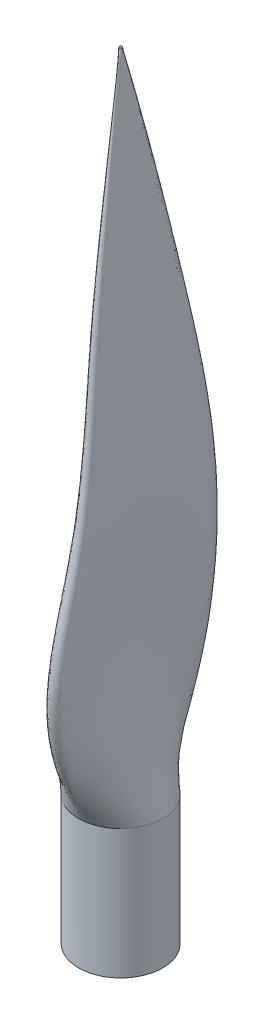
ISO-10303-21;
HEADER;
FILE_DESCRIPTION(('STEP AP214'),'2;1');
FILE_NAME('part.step','',(''),(''),'','','');
FILE_SCHEMA(('AUTOMOTIVE_DESIGN { 1 0 10303 214 1 1 1 1 }'));
ENDSEC;
DATA;
#1=APPLICATION_CONTEXT('core data for automotive mechanical design processes');
#2=APPLICATION_PROTOCOL_DEFINITION('international standard','automotive_design',2000,#1);
#3=PRODUCT_CONTEXT('',#1,'mechanical');
#4=PRODUCT('Part','Part','',(#3));
#5=PRODUCT_RELATED_PRODUCT_CATEGORY('part','',(#4));
#6=PRODUCT_DEFINITION_FORMATION('','',#4);
#7=PRODUCT_DEFINITION_CONTEXT('part definition',#1,'design');
#8=PRODUCT_DEFINITION('design','',#6,#7);
#9=PRODUCT_DEFINITION_SHAPE('','',#8);
#10=(LENGTH_UNIT() NAMED_UNIT(*) SI_UNIT(.MILLI.,.METRE.));
#11=(NAMED_UNIT(*) PLANE_ANGLE_UNIT() SI_UNIT($,.RADIAN.));
#12=(NAMED_UNIT(*) SI_UNIT($,.STERADIAN.) SOLID_ANGLE_UNIT());
#13=UNCERTAINTY_MEASURE_WITH_UNIT(LENGTH_MEASURE(1.E-05),#10,'distance_accuracy_value','');
#14=(GEOMETRIC_REPRESENTATION_CONTEXT(3) GLOBAL_UNCERTAINTY_ASSIGNED_CONTEXT((#13)) GLOBAL_UNIT_ASSIGNED_CONTEXT((#10,
#11,#12)) REPRESENTATION_CONTEXT('',''));
#15=CARTESIAN_POINT('',(0.,0.,0.));
#16=DIRECTION('',(0.,0.,1.));
#17=DIRECTION('',(1.,0.,0.));
#18=AXIS2_PLACEMENT_3D('',#15,#16,#17);
#19=CARTESIAN_POINT('',(0.,25.4,0.));
#20=DIRECTION('',(0.,-1.,0.));
#21=DIRECTION('',(0.,0.,-1.));
#22=AXIS2_PLACEMENT_3D('',#19,#20,#21);
#23=CYLINDRICAL_SURFACE('',#22,8.255);
#24=CARTESIAN_POINT('',(-4.27335253741302,25.4,-7.06282401670788));
#25=CARTESIAN_POINT('',(-4.96751837407308,25.4,-6.6428198749268));
#26=CARTESIAN_POINT('',(-6.27390073355286,25.4,-5.57087664302351));
#27=CARTESIAN_POINT('',(-7.7233117066584,25.4,-3.31584363807376));
#28=CARTESIAN_POINT('',(-8.39728544612705,25.4,-0.587640107449926));
#29=CARTESIAN_POINT('',(-8.10485596471392,25.4,2.30730782451024));
#30=CARTESIAN_POINT('',(-6.80747499668056,25.4,4.97227540233478));
#31=CARTESIAN_POINT('',(-4.66381845467683,25.4000000000001,7.01855296357349));
#32=CARTESIAN_POINT('',(-1.99557720816509,25.4,8.17777841993293));
#33=CARTESIAN_POINT('',(-0.127449606695181,25.4,8.303204000817));
#34=CARTESIAN_POINT('',(0.851143469705664,25.4,8.21139759576036));
#35=CARTESIAN_POINT('',(0.986253238460855,25.4,8.19681343529115));
#36=CARTESIAN_POINT('',(1.14731807820375,25.4,8.17509893668734));
#37=CARTESIAN_POINT('',(1.30038726857369,25.4,8.1523793231605));
#38=CARTESIAN_POINT('',(1.44941504194977,25.4,8.12747458918216));
#39=CARTESIAN_POINT('',(1.5983556307111,25.4,8.09920472922387));
#40=CARTESIAN_POINT('',(1.75059195620452,25.4,8.06746100787425));
#41=CARTESIAN_POINT('',(1.90950693977689,25.4,8.03213468972193));
#42=CARTESIAN_POINT('',(2.04335648774073,25.4,7.99853313768677));
#43=CARTESIAN_POINT('',(2.96636723888064,25.4,7.75287824941489));
#44=CARTESIAN_POINT('',(4.62553703261927,25.3999999999999,7.02181328117393));
#45=CARTESIAN_POINT('',(6.6987811872302,25.4000000000001,5.0980405105209));
#46=CARTESIAN_POINT('',(8.03066772653249,25.4,2.53574065961163));
#47=CARTESIAN_POINT('',(8.4117619604781,25.4,-0.32729039302094));
#48=CARTESIAN_POINT('',(7.81882431463251,25.4000000000001,-3.09344168533715));
#49=CARTESIAN_POINT('',(6.4096553740129,25.3999999999999,-5.42175842642299));
#50=CARTESIAN_POINT('',(4.44751141004057,25.4,-7.10255930683849));
#51=CARTESIAN_POINT('',(2.95965885796555,25.4,-7.74527804177849));
#52=CARTESIAN_POINT('',(1.82444187679371,25.4,-8.06085403114165));
#53=CARTESIAN_POINT('',(1.1897000552001,25.4,-8.1833639678869));
#54=CARTESIAN_POINT('',(0.358492645730804,25.4,-8.26054057622775));
#55=CARTESIAN_POINT('',(-0.401817806740622,25.4,-8.2557434362236));
#56=CARTESIAN_POINT('',(-1.13321159390835,25.4,-8.18813039559228));
#57=CARTESIAN_POINT('',(-1.85480147661309,25.4,-8.05480391894988));
#58=CARTESIAN_POINT('',(-2.58664795014502,25.4,-7.85312246201889));
#59=CARTESIAN_POINT('',(-3.36202806684108,25.4,-7.55504724421398));
#60=CARTESIAN_POINT('',(-3.93567658451538,25.4,-7.26713441532858));
#61=CARTESIAN_POINT('',(-4.27335253741302,25.4,-7.06282401670788));
#62=B_SPLINE_CURVE_WITH_KNOTS('',3,(#24,#25,#26,#27,#28,#29,#30,#31,#32,#33,#34,#35,#36,#37,#38,
#39,#40,#41,#42,#43,#44,#45,#46,#47,#48,#49,#50,#51,#52,#53,#54,#55,#56,#57,#58,#59,#60,#61),
.UNSPECIFIED.,.T.,.F.,(4,1,1,1,1,1,1,1,2,1,1,1,1,1,1,1,2,1,1,1,1,1,1,1,2,1,1,1,1,1,1,1,4),(0.,
0.0496445956659812,0.0992891913319621,0.148933786997943,0.198578382663925,0.248222978329906,
0.297867573995887,0.347512169661868,0.397156765327849,0.401581875505884,0.406006985683918,
0.410432095861953,0.414857206039987,0.419282316218022,0.423707426396056,0.42813253657409,
0.432557646752125,0.479338400175326,0.526119153598528,0.572899907021729,0.619680660444931,
0.666461413868133,0.713242167291334,0.760022920714536,0.806803674137737,0.83095321487052,
0.855102755603303,0.879252296336086,0.903401837068869,0.927551377801651,0.951700918534434,
0.975850459267217,1.),.UNSPECIFIED.);
#63=CARTESIAN_POINT('',(-4.27335253741302,25.4,-7.06282401670788));
#64=VERTEX_POINT('',#63);
#65=EDGE_CURVE('E11',#64,#64,#62,.T.);
#66=ORIENTED_EDGE('',*,*,#65,.F.);
#67=EDGE_LOOP('',(#66));
#68=FACE_BOUND('',#67,.T.);
#69=CARTESIAN_POINT('',(0.,0.,0.));
#70=DIRECTION('',(0.,1.,0.));
#71=DIRECTION('',(0.,0.,1.));
#72=AXIS2_PLACEMENT_3D('',#69,#70,#71);
#73=CIRCLE('',#72,8.255);
#74=CARTESIAN_POINT('',(0.,0.,8.255));
#75=VERTEX_POINT('',#74);
#76=EDGE_CURVE('E240',#75,#75,#73,.T.);
#77=ORIENTED_EDGE('',*,*,#76,.T.);
#78=EDGE_LOOP('',(#77));
#79=FACE_BOUND('',#78,.T.);
#80=ADVANCED_FACE('F231',(#68,#79),#23,.T.);
#81=CARTESIAN_POINT('',(0.,0.,0.));
#82=DIRECTION('',(0.,1.,0.));
#83=DIRECTION('',(0.,0.,1.));
#84=AXIS2_PLACEMENT_3D('',#81,#82,#83);
#85=PLANE('',#84);
#86=ORIENTED_EDGE('',*,*,#76,.F.);
#87=EDGE_LOOP('',(#86));
#88=FACE_BOUND('',#87,.T.);
#89=ADVANCED_FACE('F255',(#88),#85,.F.);
#90=CARTESIAN_POINT('',(0.,152.4,0.));
#91=DIRECTION('',(0.,1.,0.));
#92=DIRECTION('',(0.,0.,1.));
#93=AXIS2_PLACEMENT_3D('',#90,#91,#92);
#94=PLANE('',#93);
#95=CARTESIAN_POINT('',(0.,152.4,0.));
#96=DIRECTION('',(0.,1.,0.));
#97=DIRECTION('',(0.,0.,1.));
#98=AXIS2_PLACEMENT_3D('',#95,#96,#97);
#99=CIRCLE('',#98,0.254);
#100=CARTESIAN_POINT('',(0.,152.4,0.254));
#101=VERTEX_POINT('',#100);
#102=EDGE_CURVE('E245',#101,#101,#99,.T.);
#103=ORIENTED_EDGE('',*,*,#102,.T.);
#104=EDGE_LOOP('',(#103));
#105=FACE_BOUND('',#104,.T.);
#106=ADVANCED_FACE('F259',(#105),#94,.T.);
#107=CARTESIAN_POINT('',(-0.131487770381939,152.4,-0.21731766205255));
#108=CARTESIAN_POINT('',(-1.41960146994936,137.61434203223,-2.63286612465176));
#109=CARTESIAN_POINT('',(-3.31753423516274,112.279547515883,-6.11377743031786));
#110=CARTESIAN_POINT('',(-5.33355541743683,78.3936427241334,-12.045509500581));
#111=CARTESIAN_POINT('',(-5.15383717455402,50.3634576518224,-10.9212686125526));
#112=CARTESIAN_POINT('',(-4.66664537165213,33.8258304303574,-8.71165835578352));
#113=CARTESIAN_POINT('',(-4.27335253741302,25.4,-7.06282401670788));
#114=CARTESIAN_POINT('',(-0.121097741062012,152.4,-0.223604135856264));
#115=CARTESIAN_POINT('',(-1.44196891087864,137.618442171609,-2.7797593414417));
#116=CARTESIAN_POINT('',(-3.40719570255414,112.278937053666,-6.47474861606908));
#117=CARTESIAN_POINT('',(-5.36283158478709,78.3922457136525,-12.6082475267014));
#118=CARTESIAN_POINT('',(-5.1617313227206,50.3682378420951,-11.6256595710436));
#119=CARTESIAN_POINT('',(-4.42749133224989,33.8149836499334,-9.13145181777863));
#120=CARTESIAN_POINT('',(-3.93567658451538,25.4,-7.26713441532858));
#121=CARTESIAN_POINT('',(-0.102885288226488,152.4,-0.232989880535877));
#122=CARTESIAN_POINT('',(-1.47616371844216,137.627958870959,-3.08846906928819));
#123=CARTESIAN_POINT('',(-3.46004956243505,112.277676756959,-7.27932823339389));
#124=CARTESIAN_POINT('',(-5.2733510664478,78.3886548650568,-13.8168027935753));
#125=CARTESIAN_POINT('',(-4.81962583170467,50.3803635677706,-13.0637975268316));
#126=CARTESIAN_POINT('',(-3.99096471260721,33.7874998476137,-9.88547158293519));
#127=CARTESIAN_POINT('',(-3.36202806684108,25.4,-7.55504724421398));
#128=CARTESIAN_POINT('',(-0.079743437479994,152.4,-0.241339506004));
#129=CARTESIAN_POINT('',(-1.31688828158323,137.647761895818,-3.62985011046791));
#130=CARTESIAN_POINT('',(-3.06274522674674,112.273980611666,-8.60932124769152));
#131=CARTESIAN_POINT('',(-4.37956600425205,78.3835702134387,-15.6853612176166));
#132=CARTESIAN_POINT('',(-3.50694840004733,50.3985313197405,-14.8705993061026));
#133=CARTESIAN_POINT('',(-2.95135827729325,33.7461281260261,-10.7962637319965));
#134=CARTESIAN_POINT('',(-2.58664795014502,25.4,-7.85312246201889));
#135=CARTESIAN_POINT('',(-0.0572524262929098,152.4,-0.247792757177888));
#136=CARTESIAN_POINT('',(-0.89169597044188,137.669330802889,-4.13235318274576));
#137=CARTESIAN_POINT('',(-2.00854342437333,112.268968560854,-9.82287311808933));
#138=CARTESIAN_POINT('',(-2.6510937338539,78.380225421625,-17.1816422644796));
#139=CARTESIAN_POINT('',(-1.55768257057412,50.4118293558784,-16.0084214315663));
#140=CARTESIAN_POINT('',(-1.71523650314419,33.7155991937338,-11.3604326300026));
#141=CARTESIAN_POINT('',(-1.85480147661309,25.4,-8.05480391894988));
#142=CARTESIAN_POINT('',(-0.0349001132110384,152.4,-0.252101520870352));
#143=CARTESIAN_POINT('',(-0.207386431788035,137.683223368341,-4.40649678551348));
#144=CARTESIAN_POINT('',(-0.346019445719911,112.265219780614,-10.4622549723593));
#145=CARTESIAN_POINT('',(-0.327069867347946,78.3792285008187,-17.8229059803825));
#146=CARTESIAN_POINT('',(0.682524011298757,50.4169697608263,-16.2757408183637));
#147=CARTESIAN_POINT('',(-0.373854123789239,33.7036045039023,-11.5327899606597));
#148=CARTESIAN_POINT('',(-1.13321159390835,25.4,-8.18813039559228));
#149=CARTESIAN_POINT('',(-0.0121743567801832,152.4,-0.254017683894204));
#150=CARTESIAN_POINT('',(0.525228199100735,137.681215479665,-4.30859362963104));
#151=CARTESIAN_POINT('',(1.42337697232045,112.265264456903,-10.1901122626682));
#152=CARTESIAN_POINT('',(2.02852366862526,78.3804780667242,-17.3851101149937));
#153=CARTESIAN_POINT('',(2.84314068272501,50.412955755725,-15.635116027051));
#154=CARTESIAN_POINT('',(0.936773415858377,33.7126627067098,-11.3085757288925));
#155=CARTESIAN_POINT('',(-0.401817806740622,25.4,-8.2557434362236));
#156=CARTESIAN_POINT('',(0.0112923892198038,152.4,-0.253919085689212));
#157=CARTESIAN_POINT('',(1.06476140406407,137.667325875494,-3.924846486257));
#158=CARTESIAN_POINT('',(2.72522662983599,112.267866935258,-9.20987897261255));
#159=CARTESIAN_POINT('',(3.856952225808,78.3840220401997,-16.0752904423558));
#160=CARTESIAN_POINT('',(4.57737765474335,50.4002792158789,-14.1997420705297));
#161=CARTESIAN_POINT('',(2.09107928737297,33.741532316145,-10.7318366636549));
#162=CARTESIAN_POINT('',(0.358492645730804,25.4,-8.26054057622775));
#163=CARTESIAN_POINT('',(0.0358676710090707,152.4,-0.252183565695141));
#164=CARTESIAN_POINT('',(1.35623311877245,137.65054250427,-3.43728033014406));
#165=CARTESIAN_POINT('',(3.39393734245482,112.270554980812,-7.96423317114829));
#166=CARTESIAN_POINT('',(4.91324029801107,78.3893197890789,-14.3436235556946));
#167=CARTESIAN_POINT('',(5.59771102517029,50.3819570557434,-12.2182164490496));
#168=CARTESIAN_POINT('',(3.0336291528522,33.7831445418049,-9.875275487661));
#169=CARTESIAN_POINT('',(1.1897000552001,25.4,-8.1833639678869));
#170=CARTESIAN_POINT('',(0.056136673132114,152.4,-0.248026277881282));
#171=CARTESIAN_POINT('',(1.39981062210582,137.640448056181,-3.12759865395654));
#172=CARTESIAN_POINT('',(3.49932842348216,112.271640913826,-7.14860104910119));
#173=CARTESIAN_POINT('',(5.13056349159249,78.3936865072772,-13.1782562474669));
#174=CARTESIAN_POINT('',(5.7435084781135,50.3674444717551,-10.7477713136362));
#175=CARTESIAN_POINT('',(3.41452284267443,33.81599316918,-9.20436562239756));
#176=CARTESIAN_POINT('',(1.82444187679371,25.4,-8.06085403114165));
#177=CARTESIAN_POINT('',(0.0910664263989401,152.4,-0.238316247439338));
#178=CARTESIAN_POINT('',(1.44539795791019,137.627267217758,-2.69094829257171));
#179=CARTESIAN_POINT('',(3.43873713120617,112.273322905696,-6.03826054084985));
#180=CARTESIAN_POINT('',(5.23467503113059,78.398801221484,-11.5585479939895));
#181=CARTESIAN_POINT('',(5.44263579067546,50.3502319459009,-8.6681137941544));
#182=CARTESIAN_POINT('',(4.08665240805011,33.8549951206491,-8.14145920164235));
#183=CARTESIAN_POINT('',(2.95965885796555,25.4,-7.74527804177849));
#184=CARTESIAN_POINT('',(0.137012571484775,152.4,-0.2183519446296));
#185=CARTESIAN_POINT('',(1.44516996831701,137.614080338431,-2.16337741659134));
#186=CARTESIAN_POINT('',(3.39494724871068,112.275764447216,-4.65950077494338));
#187=CARTESIAN_POINT('',(5.33220416154755,78.4022309764491,-9.48957486093227));
#188=CARTESIAN_POINT('',(5.15401600830971,50.3380041778911,-5.99424829905389));
#189=CARTESIAN_POINT('',(4.73294196687297,33.8828353404432,-6.66124258456624));
#190=CARTESIAN_POINT('',(4.44751141004057,25.4,-7.10255930683849));
#191=CARTESIAN_POINT('',(0.197219749229953,152.4,-0.167124975221819));
#192=CARTESIAN_POINT('',(1.48791096062014,137.602545995586,-1.41648484045108));
#193=CARTESIAN_POINT('',(3.31168276468358,112.280942651446,-2.79179982392891));
#194=CARTESIAN_POINT('',(5.48864647917196,78.3984650042984,-6.50049077231564));
#195=CARTESIAN_POINT('',(4.69785034958292,50.3473287778912,-2.22141909469306));
#196=CARTESIAN_POINT('',(5.75290501932014,33.8623575859221,-4.0817748405647));
#197=CARTESIAN_POINT('',(6.4096553740129,25.3999999999999,-5.42175842642299));
#198=CARTESIAN_POINT('',(0.240388018180992,152.4,-0.0948054663111906));
#199=CARTESIAN_POINT('',(1.50835921184476,137.595780431015,-0.696120856795932));
#200=CARTESIAN_POINT('',(3.2577309967711,112.285432332048,-1.02777160530211));
#201=CARTESIAN_POINT('',(5.59488225160752,78.3930264114805,-3.57015099302696));
#202=CARTESIAN_POINT('',(4.38672825690872,50.3623545152811,1.36677184110298));
#203=CARTESIAN_POINT('',(6.44886141560138,33.8289475476373,-1.20219167130447));
#204=CARTESIAN_POINT('',(7.81882431463251,25.4000000000001,-3.09344168533715));
#205=CARTESIAN_POINT('',(0.259266811036513,152.4,-0.0102103720846814));
#206=CARTESIAN_POINT('',(1.51941884055665,137.592613659649,0.010203131452331));
#207=CARTESIAN_POINT('',(3.23360387632776,112.287708960313,0.670176061916787));
#208=CARTESIAN_POINT('',(5.64110401958661,78.3900913103097,-0.677793853983863));
#209=CARTESIAN_POINT('',(4.25170422183868,50.3705399998929,4.83342608786942));
#210=CARTESIAN_POINT('',(6.75082371840853,33.8107288681738,1.88962594304002));
#211=CARTESIAN_POINT('',(8.4117619604781,25.4,-0.32729039302094));
#212=CARTESIAN_POINT('',(0.246605560495143,152.4,0.07784335327074));
#213=CARTESIAN_POINT('',(1.51194545349658,137.592482001608,0.71012747198777));
#214=CARTESIAN_POINT('',(3.24931355665514,112.287328140207,2.34630077305369));
#215=CARTESIAN_POINT('',(5.61119092978413,78.3910265922393,2.18577745677862));
#216=CARTESIAN_POINT('',(4.33903716652844,50.3677517875952,8.27510059344589));
#217=CARTESIAN_POINT('',(6.55552700130805,33.8169768625763,5.0310522592273));
#218=CARTESIAN_POINT('',(8.03066772653249,25.4,2.53574065961163));
#219=CARTESIAN_POINT('',(0.206352965034295,152.4,0.157184064132563));
#220=CARTESIAN_POINT('',(1.49281175182311,137.595363432386,1.4061392342996));
#221=CARTESIAN_POINT('',(3.3001054371459,112.28559183743,4.04600782217775));
#222=CARTESIAN_POINT('',(5.51109870500205,78.3929518603474,5.01842821713763));
#223=CARTESIAN_POINT('',(4.63218808494539,50.3625093564344,11.8043741076301));
#224=CARTESIAN_POINT('',(5.89976610152049,33.8286153594125,8.02426620566437));
#225=CARTESIAN_POINT('',(6.6987811872302,25.4000000000001,5.0980405105209));
#226=CARTESIAN_POINT('',(0.142457723131385,152.4,0.215640114878277));
#227=CARTESIAN_POINT('',(1.45022287846193,137.602473596739,2.11420181714295));
#228=CARTESIAN_POINT('',(3.38745405333366,112.285001716904,5.80612116045961));
#229=CARTESIAN_POINT('',(5.34547227051406,78.3894874610378,7.8280526285485));
#230=CARTESIAN_POINT('',(5.11555307343034,50.3738814649166,15.5062752297756));
#231=CARTESIAN_POINT('',(4.81889261243251,33.8029029465749,10.7326676955433));
#232=CARTESIAN_POINT('',(4.62553703261927,25.3999999999999,7.02181328117393));
#233=CARTESIAN_POINT('',(0.0912728381194043,152.4,0.238550099981997));
#234=CARTESIAN_POINT('',(1.44355521252743,137.610106514005,2.57677279060208));
#235=CARTESIAN_POINT('',(3.43897641686983,112.287850530958,7.06617860150279));
#236=CARTESIAN_POINT('',(5.23538089801472,78.3780246823033,9.68728279387444));
#237=CARTESIAN_POINT('',(5.44025660349457,50.4090028064064,18.1651616051497));
#238=CARTESIAN_POINT('',(4.09204414679592,33.7239926855814,12.2237494408077));
#239=CARTESIAN_POINT('',(2.96636723888064,25.4,7.75287824941489));
#240=CARTESIAN_POINT('',(0.0628725073150994,152.4,0.246108711928824));
#241=CARTESIAN_POINT('',(1.41253686851821,137.616553175384,2.85806740119846));
#242=CARTESIAN_POINT('',(3.48648638903908,112.290310208957,7.77408802895483));
#243=CARTESIAN_POINT('',(5.1505708649026,78.368224163605,10.7178822994041));
#244=CARTESIAN_POINT('',(5.6863143202077,50.439018555688,19.6503571853208));
#245=CARTESIAN_POINT('',(3.54214926376805,33.6565562874003,13.0147246446215));
#246=CARTESIAN_POINT('',(2.04335648774073,25.4,7.99853313768677));
#247=CARTESIAN_POINT('',(0.0587540596854428,152.4,0.247142605837598));
#248=CARTESIAN_POINT('',(1.40752480299773,137.617704490081,2.90695408480176));
#249=CARTESIAN_POINT('',(3.47805118322475,112.290750052854,7.91046339762288));
#250=CARTESIAN_POINT('',(5.11445136463947,78.3664726177953,10.8991839445718));
#251=CARTESIAN_POINT('',(5.67940551232675,50.444382830555,19.9292509543388));
#252=CARTESIAN_POINT('',(3.47054549292518,33.6445043964803,13.1446922228532));
#253=CARTESIAN_POINT('',(1.90950693977689,25.4,8.03213468972193));
#254=CARTESIAN_POINT('',(0.053864367883216,152.4,0.248229569473054));
#255=CARTESIAN_POINT('',(1.37020164984145,137.620230457598,2.9956814447923));
#256=CARTESIAN_POINT('',(3.3932712148976,112.291042715882,8.15095579565818));
#257=CARTESIAN_POINT('',(4.98104430164541,78.3641248585196,11.1452125377497));
#258=CARTESIAN_POINT('',(5.53031098572933,50.4517280252338,20.3708563512662));
#259=CARTESIAN_POINT('',(3.30776073787769,33.6279688880941,13.348559179525));
#260=CARTESIAN_POINT('',(1.75059195620452,25.4,8.06746100787425));
#261=CARTESIAN_POINT('',(0.0491801732526493,152.4,0.249206299360735));
#262=CARTESIAN_POINT('',(1.29455494840547,137.62265817292,3.08405278607077));
#263=CARTESIAN_POINT('',(3.20011222950966,112.291089320876,8.39470636021173));
#264=CARTESIAN_POINT('',(4.76821334152597,78.3623902672442,11.3389301466369));
#265=CARTESIAN_POINT('',(5.21262339006591,50.4572433940686,20.7772851983049));
#266=CARTESIAN_POINT('',(3.08602165949779,33.6155341768821,13.533630604957));
#267=CARTESIAN_POINT('',(1.5983556307111,25.4,8.09920472922387));
#268=CARTESIAN_POINT('',(0.044597385906147,152.4,0.250076141205605));
#269=CARTESIAN_POINT('',(1.17347859440438,137.623028547378,3.14433278913701));
#270=CARTESIAN_POINT('',(2.88056342782494,112.29133982518,8.56056795683073));
#271=CARTESIAN_POINT('',(4.52108618336024,78.3615843984828,11.4662006577606));
#272=CARTESIAN_POINT('',(4.73626496457541,50.4596863198247,21.0581879561401));
#273=CARTESIAN_POINT('',(2.79998086066507,33.6100510327489,13.6662365074056));
#274=CARTESIAN_POINT('',(1.44941504194977,25.4,8.12747458918216));
#275=CARTESIAN_POINT('',(0.0400119159561136,152.4,0.250842440712631));
#276=CARTESIAN_POINT('',(1.03871270273632,137.620648185759,3.15125856523614));
#277=CARTESIAN_POINT('',(2.52147475177911,112.291910071135,8.58100476768579));
#278=CARTESIAN_POINT('',(4.24455282634198,78.3619154800876,11.5045962915376));
#279=CARTESIAN_POINT('',(4.18493406553426,50.4583313327975,21.142591761964));
#280=CARTESIAN_POINT('',(2.48331698160438,33.6131681060412,13.7171913713158));
#281=CARTESIAN_POINT('',(1.30038726857369,25.4,8.1523793231605));
#282=CARTESIAN_POINT('',(0.0353020947139616,152.4,0.251541505744226));
#283=CARTESIAN_POINT('',(0.929836346277152,137.616696904891,3.11091878303159));
#284=CARTESIAN_POINT('',(2.23098280569776,112.2925168458,8.46842944854122));
#285=CARTESIAN_POINT('',(3.95719058262783,78.3632206864691,11.4695440995458));
#286=CARTESIAN_POINT('',(3.67210449500779,50.4538462581404,21.0222224753885));
#287=CARTESIAN_POINT('',(2.18146464691502,33.6233488708787,13.6828330501132));
#288=CARTESIAN_POINT('',(1.14731807820375,25.4,8.17509893668734));
#289=CARTESIAN_POINT('',(0.0303462534911032,152.4,0.252209644162805));
#290=CARTESIAN_POINT('',(0.854673514309981,137.613291201322,3.05161944807332));
#291=CARTESIAN_POINT('',(2.03717770384365,112.29263079295,8.30407729307718));
#292=CARTESIAN_POINT('',(3.70254588077015,78.3652552754826,11.3426260393123));
#293=CARTESIAN_POINT('',(3.27328542520928,50.4472890027375,20.7609754342637));
#294=CARTESIAN_POINT('',(1.91516140207536,33.6381506770668,13.5906973248852));
#295=CARTESIAN_POINT('',(0.986253238460855,25.4,8.19681343529115));
#296=CARTESIAN_POINT('',(0.0261890298370974,152.4,0.252658387561857));
#297=CARTESIAN_POINT('',(0.827057917411889,137.611982606772,3.01147935961916));
#298=CARTESIAN_POINT('',(1.96265903368493,112.29233171388,8.19113773814335));
#299=CARTESIAN_POINT('',(3.56560611066638,78.3667994629024,11.2114553116999));
#300=CARTESIAN_POINT('',(3.09539324672316,50.442513491274,20.5399374142019));
#301=CARTESIAN_POINT('',(1.77366377555009,33.6488896823472,13.5071907252023));
#302=CARTESIAN_POINT('',(0.851143469705664,25.4,8.21139759576036));
#303=CARTESIAN_POINT('',(-0.0039215263598517,152.4,0.255483200025138));
#304=CARTESIAN_POINT('',(0.657626054426425,137.604273332588,2.76777615073629));
#305=CARTESIAN_POINT('',(1.63775896762834,112.290543426352,7.52943610733189));
#306=CARTESIAN_POINT('',(2.85282244402306,78.3759552361082,10.3394751400641));
#307=CARTESIAN_POINT('',(2.3496520598427,50.4142064242113,19.1340984790931));
#308=CARTESIAN_POINT('',(0.774309438698412,33.7125439823774,13.0027253767716));
#309=CARTESIAN_POINT('',(-0.127449606695181,25.4,8.303204000817));
#310=CARTESIAN_POINT('',(-0.0616390033785399,152.4,0.251251579901839));
#311=CARTESIAN_POINT('',(0.426387739085062,137.595997894749,2.34063358877016));
#312=CARTESIAN_POINT('',(1.05081558417719,112.288061198666,6.34662536963373));
#313=CARTESIAN_POINT('',(1.6526922512966,78.3870344829572,8.69819193648975));
#314=CARTESIAN_POINT('',(0.998607139206801,50.3801186224348,16.573491184249));
#315=CARTESIAN_POINT('',(-0.755661927292843,33.7891623210429,11.8442789515479));
#316=CARTESIAN_POINT('',(-1.99557720816509,25.4,8.17777841993293));
#317=CARTESIAN_POINT('',(-0.143594873222681,152.4,0.21637012978523));
#318=CARTESIAN_POINT('',(0.0649035056684782,137.586952814787,1.6921456549268));
#319=CARTESIAN_POINT('',(0.31290823165868,112.288735982166,4.64812354418813));
#320=CARTESIAN_POINT('',(0.00323262576900837,78.391610505625,6.11979720966056));
#321=CARTESIAN_POINT('',(-0.559676882166548,50.3651521802896,12.7579380724184));
#322=CARTESIAN_POINT('',(-3.04944571446741,33.8229906588534,9.5680429181621));
#323=CARTESIAN_POINT('',(-4.66381845467683,25.4000000000001,7.01855296357349));
#324=CARTESIAN_POINT('',(-0.209035318327059,152.4,0.152677264784713));
#325=CARTESIAN_POINT('',(-0.250290503502697,137.582385635865,1.03760876802683));
#326=CARTESIAN_POINT('',(-0.367717313564621,112.290453426693,2.99048630658301));
#327=CARTESIAN_POINT('',(-1.44096614739543,78.3908596696113,3.4116595971968));
#328=CARTESIAN_POINT('',(-1.867641173621,50.366653718349,8.99151824844312));
#329=CARTESIAN_POINT('',(-4.85412475591284,33.8197875803733,6.77121313883974));
#330=CARTESIAN_POINT('',(-6.80747499668056,25.4,4.97227540233478));
#331=CARTESIAN_POINT('',(-0.249880333287663,152.4,0.0710061156837355));
#332=CARTESIAN_POINT('',(-0.537839543415571,137.580487665186,0.367823092807346));
#333=CARTESIAN_POINT('',(-1.00336872462255,112.29131862441,1.33963697862474));
#334=CARTESIAN_POINT('',(-2.67366743740214,78.3902107908131,0.57553783469355));
#335=CARTESIAN_POINT('',(-2.95832896421542,50.3682744482115,5.2320348871152));
#336=CARTESIAN_POINT('',(-6.08273172023027,33.8162245715866,3.61193291968509));
#337=CARTESIAN_POINT('',(-8.10485596471392,25.4,2.30730782451024));
#338=CARTESIAN_POINT('',(-0.258049912700482,152.4,-0.0178101867342546));
#339=CARTESIAN_POINT('',(-0.792481172920093,137.581329794102,-0.322262809375705));
#340=CARTESIAN_POINT('',(-1.61572002853878,112.290144291074,-0.342790769693388));
#341=CARTESIAN_POINT('',(-3.68386791542665,78.3922564188667,-2.38005732443969));
#342=CARTESIAN_POINT('',(-3.87511816285394,50.3623543228707,1.41796639431405));
#343=CARTESIAN_POINT('',(-6.62599100478302,33.8294516502113,0.291473279410819));
#344=CARTESIAN_POINT('',(-8.39728544612705,25.4,-0.587640107449926));
#345=CARTESIAN_POINT('',(-0.237734538993981,152.4,-0.102340381201807));
#346=CARTESIAN_POINT('',(-1.02442840537852,137.585483276113,-1.03806361638296));
#347=CARTESIAN_POINT('',(-2.20655387508455,112.287084870409,-2.10183095998778));
#348=CARTESIAN_POINT('',(-4.47126942808367,78.3962693439324,-5.45334579508942));
#349=CARTESIAN_POINT('',(-4.59001382472883,50.3511351946643,-2.51753544096133));
#350=CARTESIAN_POINT('',(-6.52356179387365,33.8544289170692,-2.97675073302866));
#351=CARTESIAN_POINT('',(-7.7233117066584,25.4,-3.31584363807376));
#352=CARTESIAN_POINT('',(-0.193124694596623,152.4,-0.171153206451473));
#353=CARTESIAN_POINT('',(-1.22382559695463,137.594619017962,-1.7960934849752));
#354=CARTESIAN_POINT('',(-2.78483727134487,112.283145940638,-3.97480149522372));
#355=CARTESIAN_POINT('',(-5.03308015794603,78.3988909261656,-8.65224919248894));
#356=CARTESIAN_POINT('',(-5.07923522652971,50.3448185783243,-6.61436213707302));
#357=CARTESIAN_POINT('',(-5.80636621155787,33.8682547532225,-6.03929901837973));
#358=CARTESIAN_POINT('',(-6.27390073355286,25.4,-5.57087664302351));
#359=CARTESIAN_POINT('',(-0.152846719202249,152.4,-0.204394457690055));
#360=CARTESIAN_POINT('',(-1.37362036524415,137.605913310378,-2.33089539840467));
#361=CARTESIAN_POINT('',(-3.13321572804421,112.28080245279,-5.37172321231102));
#362=CARTESIAN_POINT('',(-5.27337193374931,78.396514580838,-10.8886799740179));
#363=CARTESIAN_POINT('',(-5.13760904838825,50.3536309385146,-9.4732408959182));
#364=CARTESIAN_POINT('',(-5.15827814096164,33.8481283297,-7.84868224726983));
#365=CARTESIAN_POINT('',(-4.96751837407308,25.4,-6.6428198749268));
#366=CARTESIAN_POINT('',(-0.131487770381939,152.4,-0.21731766205255));
#367=CARTESIAN_POINT('',(-1.41960146994936,137.61434203223,-2.63286612465176));
#368=CARTESIAN_POINT('',(-3.31753423516274,112.279547515883,-6.11377743031786));
#369=CARTESIAN_POINT('',(-5.33355541743683,78.3936427241334,-12.045509500581));
#370=CARTESIAN_POINT('',(-5.15383717455402,50.3634576518224,-10.9212686125526));
#371=CARTESIAN_POINT('',(-4.66664537165213,33.8258304303574,-8.71165835578352));
#372=CARTESIAN_POINT('',(-4.27335253741302,25.4,-7.06282401670788));
#373=B_SPLINE_SURFACE_WITH_KNOTS('',3,3,((#107,#108,#109,#110,#111,#112,#113),(#114,#115,#116,
#117,#118,#119,#120),(#121,#122,#123,#124,#125,#126,#127),(#128,#129,#130,#131,#132,#133,#134),
(#135,#136,#137,#138,#139,#140,#141),(#142,#143,#144,#145,#146,#147,#148),(#149,#150,#151,#152,
#153,#154,#155),(#156,#157,#158,#159,#160,#161,#162),(#163,#164,#165,#166,#167,#168,#169),(#170,
#171,#172,#173,#174,#175,#176),(#177,#178,#179,#180,#181,#182,#183),(#184,#185,#186,#187,#188,
#189,#190),(#191,#192,#193,#194,#195,#196,#197),(#198,#199,#200,#201,#202,#203,#204),(#205,#206,
#207,#208,#209,#210,#211),(#212,#213,#214,#215,#216,#217,#218),(#219,#220,#221,#222,#223,#224,
#225),(#226,#227,#228,#229,#230,#231,#232),(#233,#234,#235,#236,#237,#238,#239),(#240,#241,#242,
#243,#244,#245,#246),(#247,#248,#249,#250,#251,#252,#253),(#254,#255,#256,#257,#258,#259,#260),
(#261,#262,#263,#264,#265,#266,#267),(#268,#269,#270,#271,#272,#273,#274),(#275,#276,#277,#278,
#279,#280,#281),(#282,#283,#284,#285,#286,#287,#288),(#289,#290,#291,#292,#293,#294,#295),(#296,
#297,#298,#299,#300,#301,#302),(#303,#304,#305,#306,#307,#308,#309),(#310,#311,#312,#313,#314,
#315,#316),(#317,#318,#319,#320,#321,#322,#323),(#324,#325,#326,#327,#328,#329,#330),(#331,#332,
#333,#334,#335,#336,#337),(#338,#339,#340,#341,#342,#343,#344),(#345,#346,#347,#348,#349,#350,
#351),(#352,#353,#354,#355,#356,#357,#358),(#359,#360,#361,#362,#363,#364,#365),(#366,#367,#368,
#369,#370,#371,#372)),.UNSPECIFIED.,.T.,.F.,.F.,(4,1,1,1,1,1,1,1,2,1,1,1,1,1,1,1,2,1,1,1,1,1,1,
1,2,1,1,1,1,1,1,1,4),(4,1,1,1,4),(0.,0.0241495407327829,0.0482990814655657,0.0724486221983486,
0.0965981629311314,0.120747703663914,0.144897244396697,0.16904678512948,0.193196325862263,
0.239977079285464,0.286757832708666,0.333538586131867,0.380319339555069,0.427100092978271,
0.473880846401472,0.520661599824674,0.567442353247875,0.57186746342591,0.576292573603944,
0.580717683781978,0.585142793960013,0.589567904138047,0.593993014316082,0.598418124494116,
0.602843234672151,0.652487830338132,0.702132426004113,0.751777021670094,0.801421617336075,
0.851066213002057,0.900710808668038,0.950355404334019,1.),(0.,0.349470180512119,
0.597669666291944,0.796020061910831,1.),.UNSPECIFIED.);
#374=ORIENTED_EDGE('',*,*,#102,.F.);
#375=EDGE_LOOP('',(#374));
#376=FACE_BOUND('',#375,.T.);
#377=ORIENTED_EDGE('',*,*,#65,.T.);
#378=EDGE_LOOP('',(#377));
#379=FACE_BOUND('',#378,.T.);
#380=ADVANCED_FACE('F264',(#376,#379),#373,.T.);
#381=CLOSED_SHELL('',(#80,#89,#106,#380));
#382=MANIFOLD_SOLID_BREP('B2',#381);
#383=ADVANCED_BREP_SHAPE_REPRESENTATION('',(#18,#382),#14);
#384=SHAPE_DEFINITION_REPRESENTATION(#9,#383);
ENDSEC;
END-ISO-10303-21;
